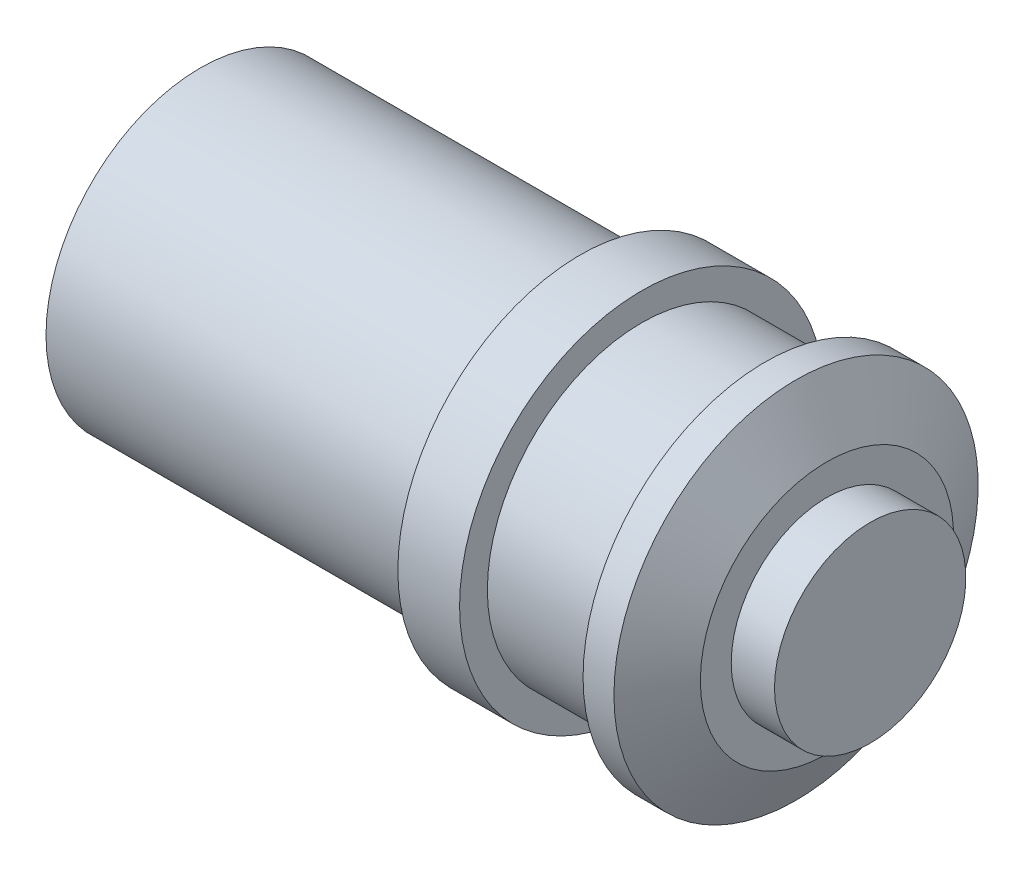
ISO-10303-21;
HEADER;
FILE_DESCRIPTION(('STEP AP214'),'2;1');
FILE_NAME('part.step','',(''),(''),'','','');
FILE_SCHEMA(('AUTOMOTIVE_DESIGN { 1 0 10303 214 1 1 1 1 }'));
ENDSEC;
DATA;
#1=APPLICATION_CONTEXT('core data for automotive mechanical design processes');
#2=APPLICATION_PROTOCOL_DEFINITION('international standard','automotive_design',2000,#1);
#3=PRODUCT_CONTEXT('',#1,'mechanical');
#4=PRODUCT('Part','Part','',(#3));
#5=PRODUCT_RELATED_PRODUCT_CATEGORY('part','',(#4));
#6=PRODUCT_DEFINITION_FORMATION('','',#4);
#7=PRODUCT_DEFINITION_CONTEXT('part definition',#1,'design');
#8=PRODUCT_DEFINITION('design','',#6,#7);
#9=PRODUCT_DEFINITION_SHAPE('','',#8);
#10=(LENGTH_UNIT() NAMED_UNIT(*) SI_UNIT(.MILLI.,.METRE.));
#11=(NAMED_UNIT(*) PLANE_ANGLE_UNIT() SI_UNIT($,.RADIAN.));
#12=(NAMED_UNIT(*) SI_UNIT($,.STERADIAN.) SOLID_ANGLE_UNIT());
#13=UNCERTAINTY_MEASURE_WITH_UNIT(LENGTH_MEASURE(1.E-05),#10,'distance_accuracy_value','');
#14=(GEOMETRIC_REPRESENTATION_CONTEXT(3) GLOBAL_UNCERTAINTY_ASSIGNED_CONTEXT((#13)) GLOBAL_UNIT_ASSIGNED_CONTEXT((#10,
#11,#12)) REPRESENTATION_CONTEXT('',''));
#15=CARTESIAN_POINT('',(0.,0.,0.));
#16=DIRECTION('',(0.,0.,1.));
#17=DIRECTION('',(1.,0.,0.));
#18=AXIS2_PLACEMENT_3D('',#15,#16,#17);
#19=CARTESIAN_POINT('',(21.7,0.,0.));
#20=DIRECTION('',(-1.,0.,0.));
#21=DIRECTION('',(0.,0.,1.));
#22=AXIS2_PLACEMENT_3D('',#19,#20,#21);
#23=PLANE('',#22);
#24=CARTESIAN_POINT('',(21.7,0.,0.));
#25=DIRECTION('',(-1.,0.,0.));
#26=DIRECTION('',(0.,0.,1.));
#27=AXIS2_PLACEMENT_3D('',#24,#25,#26);
#28=CIRCLE('',#27,3.1);
#29=CARTESIAN_POINT('',(21.7,0.,3.1));
#30=VERTEX_POINT('',#29);
#31=EDGE_CURVE('E10',#30,#30,#28,.T.);
#32=ORIENTED_EDGE('',*,*,#31,.F.);
#33=EDGE_LOOP('',(#32));
#34=FACE_BOUND('',#33,.T.);
#35=ADVANCED_FACE('F42',(#34),#23,.F.);
#36=CARTESIAN_POINT('',(0.,0.,0.));
#37=DIRECTION('',(-1.,0.,0.));
#38=DIRECTION('',(0.,0.,1.));
#39=AXIS2_PLACEMENT_3D('',#36,#37,#38);
#40=CYLINDRICAL_SURFACE('',#39,3.1);
#41=CARTESIAN_POINT('',(20.2986111111111,0.,0.));
#42=DIRECTION('',(-1.,0.,0.));
#43=DIRECTION('',(0.,0.,1.));
#44=AXIS2_PLACEMENT_3D('',#41,#42,#43);
#45=CIRCLE('',#44,3.1);
#46=CARTESIAN_POINT('',(20.2986111111111,0.,3.1));
#47=VERTEX_POINT('',#46);
#48=EDGE_CURVE('E49',#47,#47,#45,.T.);
#49=ORIENTED_EDGE('',*,*,#48,.F.);
#50=EDGE_LOOP('',(#49));
#51=FACE_BOUND('',#50,.T.);
#52=ORIENTED_EDGE('',*,*,#31,.T.);
#53=EDGE_LOOP('',(#52));
#54=FACE_BOUND('',#53,.T.);
#55=ADVANCED_FACE('F146',(#51,#54),#40,.T.);
#56=CARTESIAN_POINT('',(20.2986111111111,0.,-3.1));
#57=DIRECTION('',(-1.,0.,0.));
#58=DIRECTION('',(0.,0.,1.));
#59=AXIS2_PLACEMENT_3D('',#56,#57,#58);
#60=PLANE('',#59);
#61=CARTESIAN_POINT('',(20.2986111111111,0.,0.));
#62=DIRECTION('',(-1.,0.,0.));
#63=DIRECTION('',(0.,0.,1.));
#64=AXIS2_PLACEMENT_3D('',#61,#62,#63);
#65=CIRCLE('',#64,4.1);
#66=CARTESIAN_POINT('',(20.2986111111111,0.,4.1));
#67=VERTEX_POINT('',#66);
#68=EDGE_CURVE('E54',#67,#67,#65,.T.);
#69=ORIENTED_EDGE('',*,*,#68,.F.);
#70=EDGE_LOOP('',(#69));
#71=FACE_BOUND('',#70,.T.);
#72=ORIENTED_EDGE('',*,*,#48,.T.);
#73=EDGE_LOOP('',(#72));
#74=FACE_BOUND('',#73,.T.);
#75=ADVANCED_FACE('F141',(#71,#74),#60,.F.);
#76=CARTESIAN_POINT('',(20.2986111111111,0.,0.));
#77=DIRECTION('',(-1.,0.,0.));
#78=DIRECTION('',(0.,0.,1.));
#79=AXIS2_PLACEMENT_3D('',#76,#77,#78);
#80=CONICAL_SURFACE('',#79,4.1,1.06369782240256);
#81=CARTESIAN_POINT('',(19.2986111111111,0.,0.));
#82=DIRECTION('',(-1.,0.,0.));
#83=DIRECTION('',(0.,0.,1.));
#84=AXIS2_PLACEMENT_3D('',#81,#82,#83);
#85=CIRCLE('',#84,5.9);
#86=CARTESIAN_POINT('',(19.2986111111111,0.,5.9));
#87=VERTEX_POINT('',#86);
#88=EDGE_CURVE('E59',#87,#87,#85,.T.);
#89=ORIENTED_EDGE('',*,*,#88,.F.);
#90=EDGE_LOOP('',(#89));
#91=FACE_BOUND('',#90,.T.);
#92=ORIENTED_EDGE('',*,*,#68,.T.);
#93=EDGE_LOOP('',(#92));
#94=FACE_BOUND('',#93,.T.);
#95=ADVANCED_FACE('F135',(#91,#94),#80,.T.);
#96=CARTESIAN_POINT('',(0.,0.,0.));
#97=DIRECTION('',(-1.,0.,0.));
#98=DIRECTION('',(0.,0.,1.));
#99=AXIS2_PLACEMENT_3D('',#96,#97,#98);
#100=CYLINDRICAL_SURFACE('',#99,5.9);
#101=CARTESIAN_POINT('',(18.2986111111111,0.,0.));
#102=DIRECTION('',(-1.,0.,0.));
#103=DIRECTION('',(0.,0.,1.));
#104=AXIS2_PLACEMENT_3D('',#101,#102,#103);
#105=CIRCLE('',#104,5.9);
#106=CARTESIAN_POINT('',(18.2986111111111,0.,5.9));
#107=VERTEX_POINT('',#106);
#108=EDGE_CURVE('E65',#107,#107,#105,.T.);
#109=ORIENTED_EDGE('',*,*,#108,.F.);
#110=EDGE_LOOP('',(#109));
#111=FACE_BOUND('',#110,.T.);
#112=ORIENTED_EDGE('',*,*,#88,.T.);
#113=EDGE_LOOP('',(#112));
#114=FACE_BOUND('',#113,.T.);
#115=ADVANCED_FACE('F129',(#111,#114),#100,.T.);
#116=CARTESIAN_POINT('',(18.2986111111111,0.,-5.9));
#117=DIRECTION('',(1.,0.,0.));
#118=DIRECTION('',(0.,0.,-1.));
#119=AXIS2_PLACEMENT_3D('',#116,#117,#118);
#120=PLANE('',#119);
#121=CARTESIAN_POINT('',(18.2986111111111,0.,0.));
#122=DIRECTION('',(-1.,0.,0.));
#123=DIRECTION('',(0.,0.,1.));
#124=AXIS2_PLACEMENT_3D('',#121,#122,#123);
#125=CIRCLE('',#124,5.);
#126=CARTESIAN_POINT('',(18.2986111111111,0.,5.));
#127=VERTEX_POINT('',#126);
#128=EDGE_CURVE('E69',#127,#127,#125,.T.);
#129=ORIENTED_EDGE('',*,*,#128,.F.);
#130=EDGE_LOOP('',(#129));
#131=FACE_BOUND('',#130,.T.);
#132=ORIENTED_EDGE('',*,*,#108,.T.);
#133=EDGE_LOOP('',(#132));
#134=FACE_BOUND('',#133,.T.);
#135=ADVANCED_FACE('F123',(#131,#134),#120,.F.);
#136=CARTESIAN_POINT('',(0.,0.,0.));
#137=DIRECTION('',(-1.,0.,0.));
#138=DIRECTION('',(0.,0.,1.));
#139=AXIS2_PLACEMENT_3D('',#136,#137,#138);
#140=CYLINDRICAL_SURFACE('',#139,5.);
#141=CARTESIAN_POINT('',(14.2986111111111,0.,0.));
#142=DIRECTION('',(-1.,0.,0.));
#143=DIRECTION('',(0.,0.,1.));
#144=AXIS2_PLACEMENT_3D('',#141,#142,#143);
#145=CIRCLE('',#144,5.);
#146=CARTESIAN_POINT('',(14.2986111111111,0.,5.));
#147=VERTEX_POINT('',#146);
#148=EDGE_CURVE('E73',#147,#147,#145,.T.);
#149=ORIENTED_EDGE('',*,*,#148,.F.);
#150=EDGE_LOOP('',(#149));
#151=FACE_BOUND('',#150,.T.);
#152=ORIENTED_EDGE('',*,*,#128,.T.);
#153=EDGE_LOOP('',(#152));
#154=FACE_BOUND('',#153,.T.);
#155=ADVANCED_FACE('F117',(#151,#154),#140,.T.);
#156=CARTESIAN_POINT('',(14.2986111111111,0.,-5.));
#157=DIRECTION('',(-1.,0.,0.));
#158=DIRECTION('',(0.,0.,1.));
#159=AXIS2_PLACEMENT_3D('',#156,#157,#158);
#160=PLANE('',#159);
#161=CARTESIAN_POINT('',(14.2986111111111,0.,0.));
#162=DIRECTION('',(-1.,0.,0.));
#163=DIRECTION('',(0.,0.,1.));
#164=AXIS2_PLACEMENT_3D('',#161,#162,#163);
#165=CIRCLE('',#164,5.9);
#166=CARTESIAN_POINT('',(14.2986111111111,0.,5.9));
#167=VERTEX_POINT('',#166);
#168=EDGE_CURVE('E77',#167,#167,#165,.T.);
#169=ORIENTED_EDGE('',*,*,#168,.F.);
#170=EDGE_LOOP('',(#169));
#171=FACE_BOUND('',#170,.T.);
#172=ORIENTED_EDGE('',*,*,#148,.T.);
#173=EDGE_LOOP('',(#172));
#174=FACE_BOUND('',#173,.T.);
#175=ADVANCED_FACE('F111',(#171,#174),#160,.F.);
#176=CARTESIAN_POINT('',(0.,0.,0.));
#177=DIRECTION('',(-1.,0.,0.));
#178=DIRECTION('',(0.,0.,1.));
#179=AXIS2_PLACEMENT_3D('',#176,#177,#178);
#180=CYLINDRICAL_SURFACE('',#179,5.9);
#181=CARTESIAN_POINT('',(12.2986111111111,0.,0.));
#182=DIRECTION('',(-1.,0.,0.));
#183=DIRECTION('',(0.,0.,1.));
#184=AXIS2_PLACEMENT_3D('',#181,#182,#183);
#185=CIRCLE('',#184,5.9);
#186=CARTESIAN_POINT('',(12.2986111111111,0.,5.9));
#187=VERTEX_POINT('',#186);
#188=EDGE_CURVE('E81',#187,#187,#185,.T.);
#189=ORIENTED_EDGE('',*,*,#188,.F.);
#190=EDGE_LOOP('',(#189));
#191=FACE_BOUND('',#190,.T.);
#192=ORIENTED_EDGE('',*,*,#168,.T.);
#193=EDGE_LOOP('',(#192));
#194=FACE_BOUND('',#193,.T.);
#195=ADVANCED_FACE('F105',(#191,#194),#180,.T.);
#196=CARTESIAN_POINT('',(12.2986111111111,0.,-5.9));
#197=DIRECTION('',(1.,0.,0.));
#198=DIRECTION('',(0.,0.,-1.));
#199=AXIS2_PLACEMENT_3D('',#196,#197,#198);
#200=PLANE('',#199);
#201=CARTESIAN_POINT('',(12.2986111111111,0.,0.));
#202=DIRECTION('',(-1.,0.,0.));
#203=DIRECTION('',(0.,0.,1.));
#204=AXIS2_PLACEMENT_3D('',#201,#202,#203);
#205=CIRCLE('',#204,5.);
#206=CARTESIAN_POINT('',(12.2986111111111,0.,5.));
#207=VERTEX_POINT('',#206);
#208=EDGE_CURVE('E85',#207,#207,#205,.T.);
#209=ORIENTED_EDGE('',*,*,#208,.F.);
#210=EDGE_LOOP('',(#209));
#211=FACE_BOUND('',#210,.T.);
#212=ORIENTED_EDGE('',*,*,#188,.T.);
#213=EDGE_LOOP('',(#212));
#214=FACE_BOUND('',#213,.T.);
#215=ADVANCED_FACE('F99',(#211,#214),#200,.F.);
#216=CARTESIAN_POINT('',(0.,0.,0.));
#217=DIRECTION('',(-1.,0.,0.));
#218=DIRECTION('',(0.,0.,1.));
#219=AXIS2_PLACEMENT_3D('',#216,#217,#218);
#220=CYLINDRICAL_SURFACE('',#219,5.);
#221=CARTESIAN_POINT('',(0.,0.,0.));
#222=DIRECTION('',(-1.,0.,0.));
#223=DIRECTION('',(0.,0.,1.));
#224=AXIS2_PLACEMENT_3D('',#221,#222,#223);
#225=CIRCLE('',#224,5.);
#226=CARTESIAN_POINT('',(0.,0.,5.));
#227=VERTEX_POINT('',#226);
#228=EDGE_CURVE('E89',#227,#227,#225,.T.);
#229=ORIENTED_EDGE('',*,*,#228,.F.);
#230=EDGE_LOOP('',(#229));
#231=FACE_BOUND('',#230,.T.);
#232=ORIENTED_EDGE('',*,*,#208,.T.);
#233=EDGE_LOOP('',(#232));
#234=FACE_BOUND('',#233,.T.);
#235=ADVANCED_FACE('F96',(#231,#234),#220,.T.);
#236=CARTESIAN_POINT('',(0.,0.,-5.));
#237=DIRECTION('',(1.,0.,0.));
#238=DIRECTION('',(0.,0.,-1.));
#239=AXIS2_PLACEMENT_3D('',#236,#237,#238);
#240=PLANE('',#239);
#241=ORIENTED_EDGE('',*,*,#228,.T.);
#242=EDGE_LOOP('',(#241));
#243=FACE_BOUND('',#242,.T.);
#244=ADVANCED_FACE('F94',(#243),#240,.F.);
#245=CLOSED_SHELL('',(#35,#55,#75,#95,#115,#135,#155,#175,#195,#215,#235,#244));
#246=MANIFOLD_SOLID_BREP('B2',#245);
#247=ADVANCED_BREP_SHAPE_REPRESENTATION('',(#18,#246),#14);
#248=SHAPE_DEFINITION_REPRESENTATION(#9,#247);
ENDSEC;
END-ISO-10303-21;
